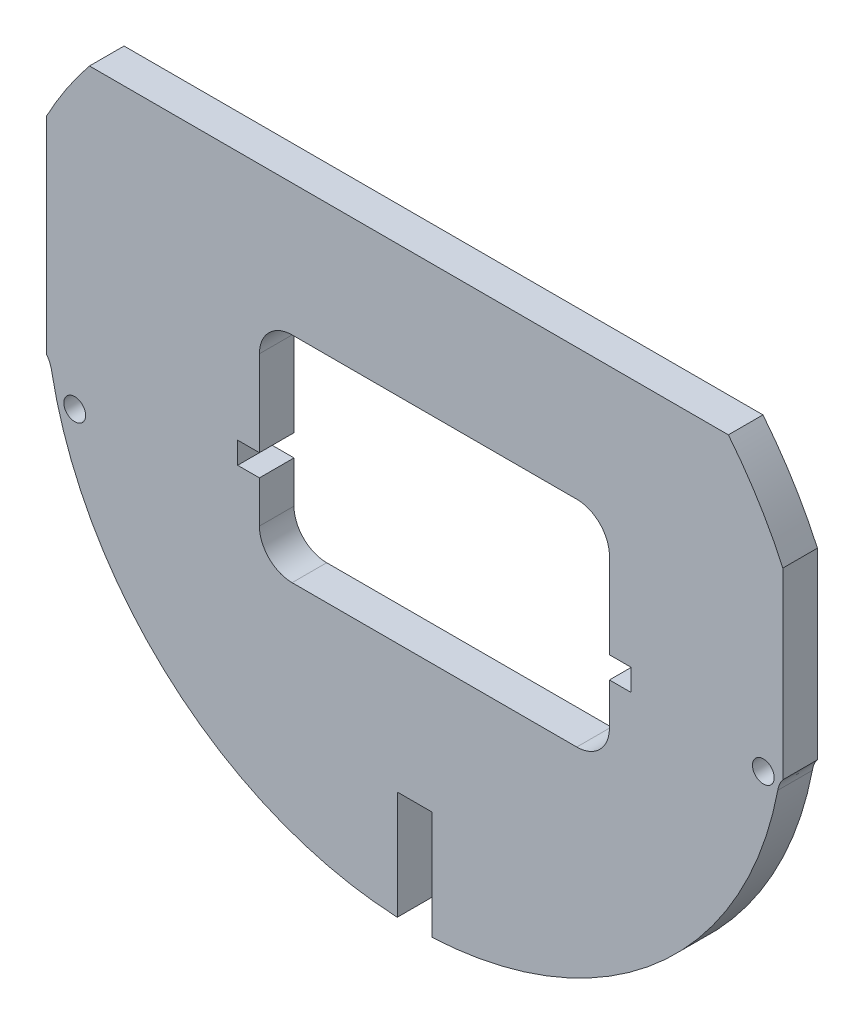
ISO-10303-21;
HEADER;
FILE_DESCRIPTION(('STEP AP214'),'2;1');
FILE_NAME('part.step','',(''),(''),'','','');
FILE_SCHEMA(('AUTOMOTIVE_DESIGN { 1 0 10303 214 1 1 1 1 }'));
ENDSEC;
DATA;
#1=APPLICATION_CONTEXT('core data for automotive mechanical design processes');
#2=APPLICATION_PROTOCOL_DEFINITION('international standard','automotive_design',2000,#1);
#3=PRODUCT_CONTEXT('',#1,'mechanical');
#4=PRODUCT('Part','Part','',(#3));
#5=PRODUCT_RELATED_PRODUCT_CATEGORY('part','',(#4));
#6=PRODUCT_DEFINITION_FORMATION('','',#4);
#7=PRODUCT_DEFINITION_CONTEXT('part definition',#1,'design');
#8=PRODUCT_DEFINITION('design','',#6,#7);
#9=PRODUCT_DEFINITION_SHAPE('','',#8);
#10=(LENGTH_UNIT() NAMED_UNIT(*) SI_UNIT(.MILLI.,.METRE.));
#11=(NAMED_UNIT(*) PLANE_ANGLE_UNIT() SI_UNIT($,.RADIAN.));
#12=(NAMED_UNIT(*) SI_UNIT($,.STERADIAN.) SOLID_ANGLE_UNIT());
#13=UNCERTAINTY_MEASURE_WITH_UNIT(LENGTH_MEASURE(1.E-05),#10,'distance_accuracy_value','');
#14=(GEOMETRIC_REPRESENTATION_CONTEXT(3) GLOBAL_UNCERTAINTY_ASSIGNED_CONTEXT((#13)) GLOBAL_UNIT_ASSIGNED_CONTEXT((#10,
#11,#12)) REPRESENTATION_CONTEXT('',''));
#15=CARTESIAN_POINT('',(0.,0.,0.));
#16=DIRECTION('',(0.,0.,1.));
#17=DIRECTION('',(1.,0.,0.));
#18=AXIS2_PLACEMENT_3D('',#15,#16,#17);
#19=CARTESIAN_POINT('',(-2.77978334795037E-09,0.129577602026689,1.5875));
#20=DIRECTION('',(0.,0.,-1.));
#21=DIRECTION('',(-1.,0.,0.));
#22=AXIS2_PLACEMENT_3D('',#19,#20,#21);
#23=CYLINDRICAL_SURFACE('',#22,33.9291564788546);
#24=CARTESIAN_POINT('',(-2.77978334795037E-09,0.129577602026689,1.5875));
#25=DIRECTION('',(0.,0.,1.));
#26=DIRECTION('',(1.,0.,0.));
#27=AXIS2_PLACEMENT_3D('',#24,#25,#26);
#28=CIRCLE('',#27,33.9291564788546);
#29=CARTESIAN_POINT('',(1.57437295803338,-33.7630323468525,1.5875));
#30=VERTEX_POINT('',#29);
#31=CARTESIAN_POINT('',(33.3337355807531,-6.19890811050484,1.5875));
#32=VERTEX_POINT('',#31);
#33=EDGE_CURVE('E442',#30,#32,#28,.T.);
#34=ORIENTED_EDGE('',*,*,#33,.F.);
#35=DIRECTION('',(0.,0.,-1.));
#36=VECTOR('',#35,1.);
#37=CARTESIAN_POINT('',(1.57437295803338,-33.7630323468525,1.5875));
#38=LINE('',#37,#36);
#39=CARTESIAN_POINT('',(1.57437295803338,-33.7630323468525,-1.5875));
#40=VERTEX_POINT('',#39);
#41=EDGE_CURVE('E332',#30,#40,#38,.T.);
#42=ORIENTED_EDGE('',*,*,#41,.T.);
#43=CARTESIAN_POINT('',(-2.77978334795037E-09,0.129577602026689,-1.5875));
#44=DIRECTION('',(0.,0.,1.));
#45=DIRECTION('',(1.,0.,0.));
#46=AXIS2_PLACEMENT_3D('',#43,#44,#45);
#47=CIRCLE('',#46,33.9291564788546);
#48=CARTESIAN_POINT('',(33.3337355807531,-6.19890811050484,-1.5875));
#49=VERTEX_POINT('',#48);
#50=EDGE_CURVE('E415',#40,#49,#47,.T.);
#51=ORIENTED_EDGE('',*,*,#50,.T.);
#52=DIRECTION('',(0.,0.,-1.));
#53=VECTOR('',#52,1.);
#54=CARTESIAN_POINT('',(33.3337355807531,-6.19890811050484,1.5875));
#55=LINE('',#54,#53);
#56=EDGE_CURVE('E451',#32,#49,#55,.T.);
#57=ORIENTED_EDGE('',*,*,#56,.F.);
#58=EDGE_LOOP('',(#34,#42,#51,#57));
#59=FACE_BOUND('',#58,.T.);
#60=ADVANCED_FACE('F41',(#59),#23,.T.);
#61=CARTESIAN_POINT('',(0.,19.7995977133014,1.5875));
#62=DIRECTION('',(0.,1.,0.));
#63=DIRECTION('',(0.,0.,1.));
#64=AXIS2_PLACEMENT_3D('',#61,#62,#63);
#65=PLANE('',#64);
#66=DIRECTION('',(1.,0.,0.));
#67=VECTOR('',#66,1.);
#68=CARTESIAN_POINT('',(0.,19.7995977133014,-1.5875));
#69=LINE('',#68,#67);
#70=CARTESIAN_POINT('',(-29.8610470161256,19.7995977133014,-1.5875));
#71=VERTEX_POINT('',#70);
#72=CARTESIAN_POINT('',(28.7983235841199,19.7995977133014,-1.5875));
#73=VERTEX_POINT('',#72);
#74=EDGE_CURVE('E339',#71,#73,#69,.T.);
#75=ORIENTED_EDGE('',*,*,#74,.F.);
#76=DIRECTION('',(0.,0.,-1.));
#77=VECTOR('',#76,1.);
#78=CARTESIAN_POINT('',(-29.8610470161256,19.7995977133014,1.5875));
#79=LINE('',#78,#77);
#80=CARTESIAN_POINT('',(-29.8610470161256,19.7995977133014,1.5875));
#81=VERTEX_POINT('',#80);
#82=EDGE_CURVE('E435',#81,#71,#79,.T.);
#83=ORIENTED_EDGE('',*,*,#82,.F.);
#84=DIRECTION('',(1.,0.,0.));
#85=VECTOR('',#84,1.);
#86=CARTESIAN_POINT('',(0.,19.7995977133014,1.5875));
#87=LINE('',#86,#85);
#88=CARTESIAN_POINT('',(28.7983235841199,19.7995977133014,1.5875));
#89=VERTEX_POINT('',#88);
#90=EDGE_CURVE('E348',#81,#89,#87,.T.);
#91=ORIENTED_EDGE('',*,*,#90,.T.);
#92=DIRECTION('',(0.,0.,-1.));
#93=VECTOR('',#92,1.);
#94=CARTESIAN_POINT('',(28.7983235841199,19.7995977133014,1.5875));
#95=LINE('',#94,#93);
#96=EDGE_CURVE('E491',#89,#73,#95,.T.);
#97=ORIENTED_EDGE('',*,*,#96,.T.);
#98=EDGE_LOOP('',(#75,#83,#91,#97));
#99=FACE_BOUND('',#98,.T.);
#100=ADVANCED_FACE('F43',(#99),#65,.T.);
#101=CARTESIAN_POINT('',(-0.531361716002824,-3.91306400992144,1.5875));
#102=DIRECTION('',(0.,0.,-1.));
#103=DIRECTION('',(-1.,0.,0.));
#104=AXIS2_PLACEMENT_3D('',#101,#102,#103);
#105=CYLINDRICAL_SURFACE('',#104,37.7163196216735);
#106=CARTESIAN_POINT('',(-0.531361716002824,-3.91306400992144,-1.5875));
#107=DIRECTION('',(0.,0.,1.));
#108=DIRECTION('',(1.,0.,0.));
#109=AXIS2_PLACEMENT_3D('',#106,#107,#108);
#110=CIRCLE('',#109,37.7163196216735);
#111=CARTESIAN_POINT('',(-33.8000174034665,13.8553718962924,-1.5875));
#112=VERTEX_POINT('',#111);
#113=EDGE_CURVE('E494',#71,#112,#110,.T.);
#114=ORIENTED_EDGE('',*,*,#113,.T.);
#115=DIRECTION('',(0.,0.,-1.));
#116=VECTOR('',#115,1.);
#117=CARTESIAN_POINT('',(-33.8000174034665,13.8553718962924,1.5875));
#118=LINE('',#117,#116);
#119=CARTESIAN_POINT('',(-33.8000174034665,13.8553718962924,1.5875));
#120=VERTEX_POINT('',#119);
#121=EDGE_CURVE('E518',#120,#112,#118,.T.);
#122=ORIENTED_EDGE('',*,*,#121,.F.);
#123=CARTESIAN_POINT('',(-0.531361716002824,-3.91306400992144,1.5875));
#124=DIRECTION('',(0.,0.,1.));
#125=DIRECTION('',(1.,0.,0.));
#126=AXIS2_PLACEMENT_3D('',#123,#124,#125);
#127=CIRCLE('',#126,37.7163196216735);
#128=EDGE_CURVE('E351',#81,#120,#127,.T.);
#129=ORIENTED_EDGE('',*,*,#128,.F.);
#130=ORIENTED_EDGE('',*,*,#82,.T.);
#131=EDGE_LOOP('',(#114,#122,#129,#130));
#132=FACE_BOUND('',#131,.T.);
#133=ADVANCED_FACE('F376',(#132),#105,.T.);
#134=CARTESIAN_POINT('',(-33.8000174034665,0.,1.5875));
#135=DIRECTION('',(1.,0.,0.));
#136=DIRECTION('',(0.,1.,0.));
#137=AXIS2_PLACEMENT_3D('',#134,#135,#136);
#138=PLANE('',#137);
#139=DIRECTION('',(0.,-1.,0.));
#140=VECTOR('',#139,1.);
#141=CARTESIAN_POINT('',(-33.8000174034665,0.,-1.5875));
#142=LINE('',#141,#140);
#143=CARTESIAN_POINT('',(-33.8000174034665,-5.12928189645589,-1.5875));
#144=VERTEX_POINT('',#143);
#145=EDGE_CURVE('E496',#112,#144,#142,.T.);
#146=ORIENTED_EDGE('',*,*,#145,.T.);
#147=DIRECTION('',(0.,0.,-1.));
#148=VECTOR('',#147,1.);
#149=CARTESIAN_POINT('',(-33.8000174034665,-5.12928189645589,1.5875));
#150=LINE('',#149,#148);
#151=CARTESIAN_POINT('',(-33.8000174034665,-5.12928189645589,1.5875));
#152=VERTEX_POINT('',#151);
#153=EDGE_CURVE('E515',#152,#144,#150,.T.);
#154=ORIENTED_EDGE('',*,*,#153,.F.);
#155=DIRECTION('',(0.,-1.,0.));
#156=VECTOR('',#155,1.);
#157=CARTESIAN_POINT('',(-33.8000174034665,0.,1.5875));
#158=LINE('',#157,#156);
#159=EDGE_CURVE('E354',#120,#152,#158,.T.);
#160=ORIENTED_EDGE('',*,*,#159,.F.);
#161=ORIENTED_EDGE('',*,*,#121,.T.);
#162=EDGE_LOOP('',(#146,#154,#160,#161));
#163=FACE_BOUND('',#162,.T.);
#164=ADVANCED_FACE('F372',(#163),#138,.F.);
#165=CARTESIAN_POINT('',(-33.8000174034665,-5.12928189645588,1.5875));
#166=CARTESIAN_POINT('',(-33.5420465161311,-5.43101031850378,1.5875));
#167=CARTESIAN_POINT('',(-33.4072615265148,-5.80935987271673,1.5875));
#168=CARTESIAN_POINT('',(-33.3339917518121,-6.19755224412202,1.5875));
#169=B_SPLINE_CURVE_WITH_KNOTS('',3,(#165,#166,#167,#168),.UNSPECIFIED.,.F.,.F.,(4,4),(0.,1.),.UNSPECIFIED.);
#170=DIRECTION('',(0.,0.,-1.));
#171=VECTOR('',#170,1.);
#172=SURFACE_OF_LINEAR_EXTRUSION('',#169,#171);
#173=CARTESIAN_POINT('',(-33.8000174034665,-5.12928189645588,-1.5875));
#174=CARTESIAN_POINT('',(-33.5420465161311,-5.43101031850378,-1.5875));
#175=CARTESIAN_POINT('',(-33.4072615265148,-5.80935987271673,-1.5875));
#176=CARTESIAN_POINT('',(-33.3339917518121,-6.19755224412202,-1.5875));
#177=B_SPLINE_CURVE_WITH_KNOTS('',3,(#173,#174,#175,#176),.UNSPECIFIED.,.F.,.F.,(4,4),(0.,1.),.UNSPECIFIED.);
#178=CARTESIAN_POINT('',(-33.3339924261858,-6.19755249274547,-1.5875));
#179=VERTEX_POINT('',#178);
#180=EDGE_CURVE('E498',#144,#179,#177,.T.);
#181=ORIENTED_EDGE('',*,*,#180,.T.);
#182=DIRECTION('',(0.,0.,-1.));
#183=VECTOR('',#182,1.);
#184=CARTESIAN_POINT('',(-33.3339924261858,-6.19755249274547,1.5875));
#185=LINE('',#184,#183);
#186=CARTESIAN_POINT('',(-33.3339924261858,-6.19755249274547,1.5875));
#187=VERTEX_POINT('',#186);
#188=EDGE_CURVE('E512',#187,#179,#185,.T.);
#189=ORIENTED_EDGE('',*,*,#188,.F.);
#190=EDGE_CURVE('E356',#152,#187,#169,.T.);
#191=ORIENTED_EDGE('',*,*,#190,.F.);
#192=ORIENTED_EDGE('',*,*,#153,.T.);
#193=EDGE_LOOP('',(#181,#189,#191,#192));
#194=FACE_BOUND('',#193,.T.);
#195=ADVANCED_FACE('F367',(#194),#172,.F.);
#196=CARTESIAN_POINT('',(0.,0.105054097099121,1.5875));
#197=DIRECTION('',(0.,0.,-1.));
#198=DIRECTION('',(-1.,0.,0.));
#199=AXIS2_PLACEMENT_3D('',#196,#197,#198);
#200=CYLINDRICAL_SURFACE('',#199,33.9245913887753);
#201=CARTESIAN_POINT('',(0.,0.105054097099121,-1.5875));
#202=DIRECTION('',(0.,0.,1.));
#203=DIRECTION('',(1.,0.,0.));
#204=AXIS2_PLACEMENT_3D('',#201,#202,#203);
#205=CIRCLE('',#204,33.9245913887753);
#206=CARTESIAN_POINT('',(-33.3337360676582,-6.19890820188936,-1.5875));
#207=VERTEX_POINT('',#206);
#208=EDGE_CURVE('E418',#179,#207,#205,.T.);
#209=ORIENTED_EDGE('',*,*,#208,.T.);
#210=DIRECTION('',(0.,0.,-1.));
#211=VECTOR('',#210,1.);
#212=CARTESIAN_POINT('',(-33.3337360676582,-6.19890820188936,1.5875));
#213=LINE('',#212,#211);
#214=CARTESIAN_POINT('',(-33.3337360676582,-6.19890820188936,1.5875));
#215=VERTEX_POINT('',#214);
#216=EDGE_CURVE('E410',#215,#207,#213,.T.);
#217=ORIENTED_EDGE('',*,*,#216,.F.);
#218=CARTESIAN_POINT('',(0.,0.105054097099121,1.5875));
#219=DIRECTION('',(0.,0.,1.));
#220=DIRECTION('',(1.,0.,0.));
#221=AXIS2_PLACEMENT_3D('',#218,#219,#220);
#222=CIRCLE('',#221,33.9245913887753);
#223=EDGE_CURVE('E361',#187,#215,#222,.T.);
#224=ORIENTED_EDGE('',*,*,#223,.F.);
#225=ORIENTED_EDGE('',*,*,#188,.T.);
#226=EDGE_LOOP('',(#209,#217,#224,#225));
#227=FACE_BOUND('',#226,.T.);
#228=ADVANCED_FACE('F371',(#227),#200,.T.);
#229=CARTESIAN_POINT('',(-1.60062704196662,-33.7618026066345,-1.5875));
#230=VERTEX_POINT('',#229);
#231=EDGE_CURVE('E406',#207,#230,#47,.T.);
#232=ORIENTED_EDGE('',*,*,#231,.T.);
#233=DIRECTION('',(0.,0.,-1.));
#234=VECTOR('',#233,1.);
#235=CARTESIAN_POINT('',(-1.60062704196662,-33.7618026066344,1.5875));
#236=LINE('',#235,#234);
#237=CARTESIAN_POINT('',(-1.60062704196662,-33.7618026066345,1.5875));
#238=VERTEX_POINT('',#237);
#239=EDGE_CURVE('E328',#230,#238,#236,.F.);
#240=ORIENTED_EDGE('',*,*,#239,.T.);
#241=EDGE_CURVE('E445',#215,#238,#28,.T.);
#242=ORIENTED_EDGE('',*,*,#241,.F.);
#243=ORIENTED_EDGE('',*,*,#216,.T.);
#244=EDGE_LOOP('',(#232,#240,#242,#243));
#245=FACE_BOUND('',#244,.T.);
#246=ADVANCED_FACE('F386',(#245),#23,.T.);
#247=CARTESIAN_POINT('',(33.3337360620987,-6.19890820188937,1.5875));
#248=CARTESIAN_POINT('',(33.3702736485357,-6.0049524899182,1.5875));
#249=CARTESIAN_POINT('',(33.4208271632723,-5.81577116696376,1.5875));
#250=CARTESIAN_POINT('',(33.5703270651029,-5.45389308014613,1.5875));
#251=CARTESIAN_POINT('',(33.6709126996301,-5.28028559029285,1.5875));
#252=CARTESIAN_POINT('',(33.8000173979069,-5.12928189645592,1.5875));
#253=B_SPLINE_CURVE_WITH_KNOTS('',3,(#247,#248,#249,#250,#251,#252),.UNSPECIFIED.,.F.,.F.,(4,2,
4),(0.,0.5,1.),.UNSPECIFIED.);
#254=DIRECTION('',(0.,0.,-1.));
#255=VECTOR('',#254,1.);
#256=SURFACE_OF_LINEAR_EXTRUSION('',#253,#255);
#257=CARTESIAN_POINT('',(33.3337360620987,-6.19890820188937,-1.5875));
#258=CARTESIAN_POINT('',(33.3702736485357,-6.0049524899182,-1.5875));
#259=CARTESIAN_POINT('',(33.4208271632723,-5.81577116696376,-1.5875));
#260=CARTESIAN_POINT('',(33.5703270651029,-5.45389308014613,-1.5875));
#261=CARTESIAN_POINT('',(33.6709126996301,-5.28028559029285,-1.5875));
#262=CARTESIAN_POINT('',(33.8000173979069,-5.12928189645592,-1.5875));
#263=B_SPLINE_CURVE_WITH_KNOTS('',3,(#257,#258,#259,#260,#261,#262),.UNSPECIFIED.,.F.,.F.,(4,2,
4),(0.,0.5,1.),.UNSPECIFIED.);
#264=CARTESIAN_POINT('',(33.8000173979069,-5.1292818964559,-1.5875));
#265=VERTEX_POINT('',#264);
#266=EDGE_CURVE('E414',#49,#265,#263,.T.);
#267=ORIENTED_EDGE('',*,*,#266,.T.);
#268=DIRECTION('',(0.,0.,-1.));
#269=VECTOR('',#268,1.);
#270=CARTESIAN_POINT('',(33.8000173979069,-5.1292818964559,1.5875));
#271=LINE('',#270,#269);
#272=CARTESIAN_POINT('',(33.8000173979069,-5.1292818964559,1.5875));
#273=VERTEX_POINT('',#272);
#274=EDGE_CURVE('E455',#273,#265,#271,.T.);
#275=ORIENTED_EDGE('',*,*,#274,.F.);
#276=CARTESIAN_POINT('',(33.8000173979069,-5.12928189645592,1.5875));
#277=CARTESIAN_POINT('',(33.6709126996301,-5.28028559029285,1.5875));
#278=CARTESIAN_POINT('',(33.5703270651029,-5.45389308014613,1.5875));
#279=CARTESIAN_POINT('',(33.4208271632723,-5.81577116696376,1.5875));
#280=CARTESIAN_POINT('',(33.3702736485357,-6.0049524899182,1.5875));
#281=CARTESIAN_POINT('',(33.3337360620987,-6.19890820188937,1.5875));
#282=B_SPLINE_CURVE_WITH_KNOTS('',3,(#276,#277,#278,#279,#280,#281),.UNSPECIFIED.,.F.,.F.,(4,2,
4),(0.,0.5,1.),.UNSPECIFIED.);
#283=EDGE_CURVE('E466',#32,#273,#282,.F.);
#284=ORIENTED_EDGE('',*,*,#283,.F.);
#285=ORIENTED_EDGE('',*,*,#56,.T.);
#286=EDGE_LOOP('',(#267,#275,#284,#285));
#287=FACE_BOUND('',#286,.T.);
#288=ADVANCED_FACE('F393',(#287),#256,.F.);
#289=CARTESIAN_POINT('',(33.8000173979069,0.,1.5875));
#290=DIRECTION('',(-1.,0.,0.));
#291=DIRECTION('',(0.,0.,1.));
#292=AXIS2_PLACEMENT_3D('',#289,#290,#291);
#293=PLANE('',#292);
#294=DIRECTION('',(0.,1.,0.));
#295=VECTOR('',#294,1.);
#296=CARTESIAN_POINT('',(33.8000173979069,0.,-1.5875));
#297=LINE('',#296,#295);
#298=CARTESIAN_POINT('',(33.8000173979069,11.7035032806593,-1.5875));
#299=VERTEX_POINT('',#298);
#300=EDGE_CURVE('E417',#265,#299,#297,.T.);
#301=ORIENTED_EDGE('',*,*,#300,.T.);
#302=DIRECTION('',(0.,0.,-1.));
#303=VECTOR('',#302,1.);
#304=CARTESIAN_POINT('',(33.8000173979069,11.7035032806593,1.5875));
#305=LINE('',#304,#303);
#306=CARTESIAN_POINT('',(33.8000173979069,11.7035032806593,1.5875));
#307=VERTEX_POINT('',#306);
#308=EDGE_CURVE('E460',#307,#299,#305,.T.);
#309=ORIENTED_EDGE('',*,*,#308,.F.);
#310=DIRECTION('',(0.,1.,0.));
#311=VECTOR('',#310,1.);
#312=CARTESIAN_POINT('',(33.8000173979069,0.,1.5875));
#313=LINE('',#312,#311);
#314=EDGE_CURVE('E463',#273,#307,#313,.T.);
#315=ORIENTED_EDGE('',*,*,#314,.F.);
#316=ORIENTED_EDGE('',*,*,#274,.T.);
#317=EDGE_LOOP('',(#301,#309,#315,#316));
#318=FACE_BOUND('',#317,.T.);
#319=ADVANCED_FACE('F399',(#318),#293,.F.);
#320=CARTESIAN_POINT('',(-0.531361716002824,-3.91306400992144,1.5875));
#321=DIRECTION('',(0.,0.,-1.));
#322=DIRECTION('',(-1.,0.,0.));
#323=AXIS2_PLACEMENT_3D('',#320,#321,#322);
#324=CYLINDRICAL_SURFACE('',#323,37.7163196216735);
#325=CARTESIAN_POINT('',(-0.531361716002824,-3.91306400992144,-1.5875));
#326=DIRECTION('',(0.,0.,1.));
#327=DIRECTION('',(1.,0.,0.));
#328=AXIS2_PLACEMENT_3D('',#325,#326,#327);
#329=CIRCLE('',#328,37.7163196216735);
#330=EDGE_CURVE('E352',#299,#73,#329,.T.);
#331=ORIENTED_EDGE('',*,*,#330,.T.);
#332=ORIENTED_EDGE('',*,*,#96,.F.);
#333=CARTESIAN_POINT('',(-0.531361716002824,-3.91306400992144,1.5875));
#334=DIRECTION('',(0.,0.,1.));
#335=DIRECTION('',(1.,0.,0.));
#336=AXIS2_PLACEMENT_3D('',#333,#334,#335);
#337=CIRCLE('',#336,37.7163196216735);
#338=EDGE_CURVE('E465',#307,#89,#337,.T.);
#339=ORIENTED_EDGE('',*,*,#338,.F.);
#340=ORIENTED_EDGE('',*,*,#308,.T.);
#341=EDGE_LOOP('',(#331,#332,#339,#340));
#342=FACE_BOUND('',#341,.T.);
#343=ADVANCED_FACE('F537',(#342),#324,.T.);
#344=CARTESIAN_POINT('',(0.,0.,1.5875));
#345=DIRECTION('',(0.,0.,1.));
#346=DIRECTION('',(1.,0.,0.));
#347=AXIS2_PLACEMENT_3D('',#344,#345,#346);
#348=PLANE('',#347);
#349=DIRECTION('',(0.,-1.,0.));
#350=VECTOR('',#349,1.);
#351=CARTESIAN_POINT('',(-14.2577246988936,0.,1.5875));
#352=LINE('',#351,#350);
#353=CARTESIAN_POINT('',(-14.2577246988936,4.7171836988647,1.5875));
#354=VERTEX_POINT('',#353);
#355=CARTESIAN_POINT('',(-14.2577246988936,-3.1501579017386,1.5875));
#356=VERTEX_POINT('',#355);
#357=EDGE_CURVE('E56',#354,#356,#352,.T.);
#358=ORIENTED_EDGE('',*,*,#357,.F.);
#359=CARTESIAN_POINT('',(-11.2577246988936,4.7171836988647,1.5875));
#360=DIRECTION('',(0.,0.,1.));
#361=DIRECTION('',(1.,0.,0.));
#362=AXIS2_PLACEMENT_3D('',#359,#360,#361);
#363=CIRCLE('',#362,3.);
#364=CARTESIAN_POINT('',(-11.2577246988936,7.71718369886469,1.5875));
#365=VERTEX_POINT('',#364);
#366=EDGE_CURVE('E286',#365,#354,#363,.T.);
#367=ORIENTED_EDGE('',*,*,#366,.F.);
#368=DIRECTION('',(-1.,0.,0.));
#369=VECTOR('',#368,1.);
#370=CARTESIAN_POINT('',(0.,7.71718369886469,1.5875));
#371=LINE('',#370,#369);
#372=CARTESIAN_POINT('',(14.8786006125927,7.71718369886469,1.5875));
#373=VERTEX_POINT('',#372);
#374=EDGE_CURVE('E283',#373,#365,#371,.T.);
#375=ORIENTED_EDGE('',*,*,#374,.F.);
#376=CARTESIAN_POINT('',(14.8786006125927,4.7171836988647,1.5875));
#377=DIRECTION('',(0.,0.,1.));
#378=DIRECTION('',(1.,0.,0.));
#379=AXIS2_PLACEMENT_3D('',#376,#377,#378);
#380=CIRCLE('',#379,3.);
#381=CARTESIAN_POINT('',(17.8786006125927,4.7171836988647,1.5875));
#382=VERTEX_POINT('',#381);
#383=EDGE_CURVE('E280',#382,#373,#380,.T.);
#384=ORIENTED_EDGE('',*,*,#383,.F.);
#385=DIRECTION('',(0.,1.,0.));
#386=VECTOR('',#385,1.);
#387=CARTESIAN_POINT('',(17.8786006125927,0.,1.5875));
#388=LINE('',#387,#386);
#389=CARTESIAN_POINT('',(17.8786006125927,-3.1501579017386,1.5875));
#390=VERTEX_POINT('',#389);
#391=EDGE_CURVE('E271',#390,#382,#388,.T.);
#392=ORIENTED_EDGE('',*,*,#391,.F.);
#393=DIRECTION('',(1.,0.,0.));
#394=VECTOR('',#393,1.);
#395=CARTESIAN_POINT('',(0.,-3.15015790173858,1.5875));
#396=LINE('',#395,#394);
#397=CARTESIAN_POINT('',(19.8786006125927,-3.1501579017386,1.5875));
#398=VERTEX_POINT('',#397);
#399=EDGE_CURVE('E277',#390,#398,#396,.T.);
#400=ORIENTED_EDGE('',*,*,#399,.T.);
#401=DIRECTION('',(0.,-1.,0.));
#402=VECTOR('',#401,1.);
#403=CARTESIAN_POINT('',(19.8786006125928,-1.37935500608926E-13,1.5875));
#404=LINE('',#403,#402);
#405=CARTESIAN_POINT('',(19.8786006125927,-5.1501579017386,1.5875));
#406=VERTEX_POINT('',#405);
#407=EDGE_CURVE('E274',#398,#406,#404,.T.);
#408=ORIENTED_EDGE('',*,*,#407,.T.);
#409=DIRECTION('',(-1.,0.,0.));
#410=VECTOR('',#409,1.);
#411=CARTESIAN_POINT('',(0.,-5.1501579017386,1.5875));
#412=LINE('',#411,#410);
#413=CARTESIAN_POINT('',(17.8786006125927,-5.1501579017386,1.5875));
#414=VERTEX_POINT('',#413);
#415=EDGE_CURVE('E270',#406,#414,#412,.T.);
#416=ORIENTED_EDGE('',*,*,#415,.T.);
#417=CARTESIAN_POINT('',(17.8786006125927,-8.98425628314143,1.5875));
#418=VERTEX_POINT('',#417);
#419=EDGE_CURVE('E267',#418,#414,#388,.T.);
#420=ORIENTED_EDGE('',*,*,#419,.F.);
#421=CARTESIAN_POINT('',(14.8786006125927,-8.98425628314143,1.5875));
#422=DIRECTION('',(0.,0.,1.));
#423=DIRECTION('',(1.,0.,0.));
#424=AXIS2_PLACEMENT_3D('',#421,#422,#423);
#425=CIRCLE('',#424,3.);
#426=CARTESIAN_POINT('',(14.8786006125927,-11.9842562831414,1.5875));
#427=VERTEX_POINT('',#426);
#428=EDGE_CURVE('E264',#427,#418,#425,.T.);
#429=ORIENTED_EDGE('',*,*,#428,.F.);
#430=DIRECTION('',(1.,0.,0.));
#431=VECTOR('',#430,1.);
#432=CARTESIAN_POINT('',(0.,-11.9842562831414,1.5875));
#433=LINE('',#432,#431);
#434=CARTESIAN_POINT('',(-11.2577246988936,-11.9842562831414,1.5875));
#435=VERTEX_POINT('',#434);
#436=EDGE_CURVE('E261',#435,#427,#433,.T.);
#437=ORIENTED_EDGE('',*,*,#436,.F.);
#438=CARTESIAN_POINT('',(-11.2577246988936,-8.98425628314143,1.5875));
#439=DIRECTION('',(0.,0.,1.));
#440=DIRECTION('',(1.,0.,0.));
#441=AXIS2_PLACEMENT_3D('',#438,#439,#440);
#442=CIRCLE('',#441,3.);
#443=CARTESIAN_POINT('',(-14.2577246988936,-8.98425628314143,1.5875));
#444=VERTEX_POINT('',#443);
#445=EDGE_CURVE('E258',#444,#435,#442,.T.);
#446=ORIENTED_EDGE('',*,*,#445,.F.);
#447=CARTESIAN_POINT('',(-14.2577246988936,-5.1501579017386,1.5875));
#448=VERTEX_POINT('',#447);
#449=EDGE_CURVE('E254',#448,#444,#352,.T.);
#450=ORIENTED_EDGE('',*,*,#449,.F.);
#451=DIRECTION('',(1.,0.,0.));
#452=VECTOR('',#451,1.);
#453=CARTESIAN_POINT('',(0.,-5.1501579017386,1.5875));
#454=LINE('',#453,#452);
#455=CARTESIAN_POINT('',(-16.2577246988936,-5.1501579017386,1.5875));
#456=VERTEX_POINT('',#455);
#457=EDGE_CURVE('E252',#456,#448,#454,.T.);
#458=ORIENTED_EDGE('',*,*,#457,.F.);
#459=DIRECTION('',(0.,-1.,0.));
#460=VECTOR('',#459,1.);
#461=CARTESIAN_POINT('',(-16.2577246988936,-1.12810626804555E-13,1.5875));
#462=LINE('',#461,#460);
#463=CARTESIAN_POINT('',(-16.2577246988936,-3.1501579017386,1.5875));
#464=VERTEX_POINT('',#463);
#465=EDGE_CURVE('E235',#464,#456,#462,.T.);
#466=ORIENTED_EDGE('',*,*,#465,.F.);
#467=DIRECTION('',(-1.,0.,0.));
#468=VECTOR('',#467,1.);
#469=CARTESIAN_POINT('',(0.,-3.15015790173859,1.5875));
#470=LINE('',#469,#468);
#471=EDGE_CURVE('E244',#356,#464,#470,.T.);
#472=ORIENTED_EDGE('',*,*,#471,.F.);
#473=EDGE_LOOP('',(#358,#367,#375,#384,#392,#400,#408,#416,#420,#429,#437,#446,#450,#458,#466,#472));
#474=FACE_BOUND('',#473,.T.);
#475=DIRECTION('',(0.,1.,0.));
#476=VECTOR('',#475,1.);
#477=CARTESIAN_POINT('',(1.57437295803338,-34.7701759650406,1.5875));
#478=LINE('',#477,#476);
#479=CARTESIAN_POINT('',(1.57437295803338,-23.7996045123723,1.5875));
#480=VERTEX_POINT('',#479);
#481=EDGE_CURVE('E322',#30,#480,#478,.T.);
#482=ORIENTED_EDGE('',*,*,#481,.F.);
#483=ORIENTED_EDGE('',*,*,#33,.T.);
#484=ORIENTED_EDGE('',*,*,#283,.T.);
#485=ORIENTED_EDGE('',*,*,#314,.T.);
#486=ORIENTED_EDGE('',*,*,#338,.T.);
#487=ORIENTED_EDGE('',*,*,#90,.F.);
#488=ORIENTED_EDGE('',*,*,#128,.T.);
#489=ORIENTED_EDGE('',*,*,#159,.T.);
#490=ORIENTED_EDGE('',*,*,#190,.T.);
#491=ORIENTED_EDGE('',*,*,#223,.T.);
#492=ORIENTED_EDGE('',*,*,#241,.T.);
#493=DIRECTION('',(0.,-1.,0.));
#494=VECTOR('',#493,1.);
#495=CARTESIAN_POINT('',(-1.60062704196662,-23.7996045123723,1.5875));
#496=LINE('',#495,#494);
#497=CARTESIAN_POINT('',(-1.60062704196662,-23.7996045123723,1.5875));
#498=VERTEX_POINT('',#497);
#499=EDGE_CURVE('E320',#498,#238,#496,.T.);
#500=ORIENTED_EDGE('',*,*,#499,.F.);
#501=DIRECTION('',(-1.,0.,0.));
#502=VECTOR('',#501,1.);
#503=CARTESIAN_POINT('',(-1.60062704196662,-23.7996045123723,1.5875));
#504=LINE('',#503,#502);
#505=EDGE_CURVE('E291',#480,#498,#504,.T.);
#506=ORIENTED_EDGE('',*,*,#505,.F.);
#507=EDGE_LOOP('',(#482,#483,#484,#485,#486,#487,#488,#489,#490,#491,#492,#500,#506));
#508=FACE_BOUND('',#507,.T.);
#509=CARTESIAN_POINT('',(-31.2160643993176,-8.16443665346959,1.5875));
#510=DIRECTION('',(0.,0.,1.));
#511=DIRECTION('',(1.,0.,0.));
#512=AXIS2_PLACEMENT_3D('',#509,#510,#511);
#513=CIRCLE('',#512,1.);
#514=CARTESIAN_POINT('',(-30.2160643993176,-8.16443665346959,1.5875));
#515=VERTEX_POINT('',#514);
#516=EDGE_CURVE('E340',#515,#515,#513,.T.);
#517=ORIENTED_EDGE('',*,*,#516,.F.);
#518=EDGE_LOOP('',(#517));
#519=FACE_BOUND('',#518,.T.);
#520=CARTESIAN_POINT('',(32.0093023749139,-5.35898951564747,1.5875));
#521=DIRECTION('',(0.,0.,1.));
#522=DIRECTION('',(1.,0.,0.));
#523=AXIS2_PLACEMENT_3D('',#520,#521,#522);
#524=CIRCLE('',#523,0.999999999998764);
#525=CARTESIAN_POINT('',(33.0093023749126,-5.35898951564747,1.5875));
#526=VERTEX_POINT('',#525);
#527=EDGE_CURVE('E343',#526,#526,#524,.T.);
#528=ORIENTED_EDGE('',*,*,#527,.F.);
#529=EDGE_LOOP('',(#528));
#530=FACE_BOUND('',#529,.T.);
#531=ADVANCED_FACE('F248',(#474,#508,#519,#530),#348,.T.);
#532=CARTESIAN_POINT('',(0.,0.,-1.5875));
#533=DIRECTION('',(0.,0.,1.));
#534=DIRECTION('',(1.,0.,0.));
#535=AXIS2_PLACEMENT_3D('',#532,#533,#534);
#536=PLANE('',#535);
#537=CARTESIAN_POINT('',(-11.2577246988936,4.7171836988647,-1.5875));
#538=DIRECTION('',(0.,0.,1.));
#539=DIRECTION('',(1.,0.,0.));
#540=AXIS2_PLACEMENT_3D('',#537,#538,#539);
#541=CIRCLE('',#540,3.);
#542=CARTESIAN_POINT('',(-11.2577246988936,7.71718369886469,-1.5875));
#543=VERTEX_POINT('',#542);
#544=CARTESIAN_POINT('',(-14.2577246988936,4.7171836988647,-1.5875));
#545=VERTEX_POINT('',#544);
#546=EDGE_CURVE('E49',#543,#545,#541,.T.);
#547=ORIENTED_EDGE('',*,*,#546,.T.);
#548=DIRECTION('',(0.,-1.,0.));
#549=VECTOR('',#548,1.);
#550=CARTESIAN_POINT('',(-14.2577246988936,0.,-1.5875));
#551=LINE('',#550,#549);
#552=CARTESIAN_POINT('',(-14.2577246988936,-3.1501579017386,-1.5875));
#553=VERTEX_POINT('',#552);
#554=EDGE_CURVE('E11',#545,#553,#551,.T.);
#555=ORIENTED_EDGE('',*,*,#554,.T.);
#556=DIRECTION('',(-1.,0.,0.));
#557=VECTOR('',#556,1.);
#558=CARTESIAN_POINT('',(0.,-3.15015790173859,-1.5875));
#559=LINE('',#558,#557);
#560=CARTESIAN_POINT('',(-16.2577246988936,-3.1501579017386,-1.5875));
#561=VERTEX_POINT('',#560);
#562=EDGE_CURVE('E441',#553,#561,#559,.T.);
#563=ORIENTED_EDGE('',*,*,#562,.T.);
#564=DIRECTION('',(0.,-1.,0.));
#565=VECTOR('',#564,1.);
#566=CARTESIAN_POINT('',(-16.2577246988936,-1.12810626804555E-13,-1.5875));
#567=LINE('',#566,#565);
#568=CARTESIAN_POINT('',(-16.2577246988936,-5.1501579017386,-1.5875));
#569=VERTEX_POINT('',#568);
#570=EDGE_CURVE('E238',#561,#569,#567,.T.);
#571=ORIENTED_EDGE('',*,*,#570,.T.);
#572=DIRECTION('',(1.,0.,0.));
#573=VECTOR('',#572,1.);
#574=CARTESIAN_POINT('',(0.,-5.1501579017386,-1.5875));
#575=LINE('',#574,#573);
#576=CARTESIAN_POINT('',(-14.2577246988936,-5.1501579017386,-1.5875));
#577=VERTEX_POINT('',#576);
#578=EDGE_CURVE('E805',#569,#577,#575,.T.);
#579=ORIENTED_EDGE('',*,*,#578,.T.);
#580=DIRECTION('',(0.,-1.,0.));
#581=VECTOR('',#580,1.);
#582=CARTESIAN_POINT('',(-14.2577246988936,0.,-1.5875));
#583=LINE('',#582,#581);
#584=CARTESIAN_POINT('',(-14.2577246988936,-8.98425628314143,-1.5875));
#585=VERTEX_POINT('',#584);
#586=EDGE_CURVE('E808',#577,#585,#583,.T.);
#587=ORIENTED_EDGE('',*,*,#586,.T.);
#588=CARTESIAN_POINT('',(-11.2577246988936,-8.98425628314143,-1.5875));
#589=DIRECTION('',(0.,0.,1.));
#590=DIRECTION('',(1.,0.,0.));
#591=AXIS2_PLACEMENT_3D('',#588,#589,#590);
#592=CIRCLE('',#591,3.);
#593=CARTESIAN_POINT('',(-11.2577246988936,-11.9842562831414,-1.5875));
#594=VERTEX_POINT('',#593);
#595=EDGE_CURVE('E812',#585,#594,#592,.T.);
#596=ORIENTED_EDGE('',*,*,#595,.T.);
#597=DIRECTION('',(1.,0.,0.));
#598=VECTOR('',#597,1.);
#599=CARTESIAN_POINT('',(0.,-11.9842562831414,-1.5875));
#600=LINE('',#599,#598);
#601=CARTESIAN_POINT('',(14.8786006125927,-11.9842562831414,-1.5875));
#602=VERTEX_POINT('',#601);
#603=EDGE_CURVE('E815',#594,#602,#600,.T.);
#604=ORIENTED_EDGE('',*,*,#603,.T.);
#605=CARTESIAN_POINT('',(14.8786006125927,-8.98425628314143,-1.5875));
#606=DIRECTION('',(0.,0.,1.));
#607=DIRECTION('',(1.,0.,0.));
#608=AXIS2_PLACEMENT_3D('',#605,#606,#607);
#609=CIRCLE('',#608,3.);
#610=CARTESIAN_POINT('',(17.8786006125927,-8.98425628314143,-1.5875));
#611=VERTEX_POINT('',#610);
#612=EDGE_CURVE('E818',#602,#611,#609,.T.);
#613=ORIENTED_EDGE('',*,*,#612,.T.);
#614=DIRECTION('',(0.,1.,0.));
#615=VECTOR('',#614,1.);
#616=CARTESIAN_POINT('',(17.8786006125927,0.,-1.5875));
#617=LINE('',#616,#615);
#618=CARTESIAN_POINT('',(17.8786006125927,-5.1501579017386,-1.5875));
#619=VERTEX_POINT('',#618);
#620=EDGE_CURVE('E821',#611,#619,#617,.T.);
#621=ORIENTED_EDGE('',*,*,#620,.T.);
#622=DIRECTION('',(-1.,0.,0.));
#623=VECTOR('',#622,1.);
#624=CARTESIAN_POINT('',(0.,-5.1501579017386,-1.5875));
#625=LINE('',#624,#623);
#626=CARTESIAN_POINT('',(19.8786006125927,-5.1501579017386,-1.5875));
#627=VERTEX_POINT('',#626);
#628=EDGE_CURVE('E824',#627,#619,#625,.T.);
#629=ORIENTED_EDGE('',*,*,#628,.F.);
#630=DIRECTION('',(0.,-1.,0.));
#631=VECTOR('',#630,1.);
#632=CARTESIAN_POINT('',(19.8786006125928,-1.37935500608926E-13,-1.5875));
#633=LINE('',#632,#631);
#634=CARTESIAN_POINT('',(19.8786006125927,-3.1501579017386,-1.5875));
#635=VERTEX_POINT('',#634);
#636=EDGE_CURVE('E826',#635,#627,#633,.T.);
#637=ORIENTED_EDGE('',*,*,#636,.F.);
#638=DIRECTION('',(1.,0.,0.));
#639=VECTOR('',#638,1.);
#640=CARTESIAN_POINT('',(0.,-3.15015790173858,-1.5875));
#641=LINE('',#640,#639);
#642=CARTESIAN_POINT('',(17.8786006125927,-3.1501579017386,-1.5875));
#643=VERTEX_POINT('',#642);
#644=EDGE_CURVE('E828',#643,#635,#641,.T.);
#645=ORIENTED_EDGE('',*,*,#644,.F.);
#646=DIRECTION('',(0.,1.,0.));
#647=VECTOR('',#646,1.);
#648=CARTESIAN_POINT('',(17.8786006125927,0.,-1.5875));
#649=LINE('',#648,#647);
#650=CARTESIAN_POINT('',(17.8786006125927,4.7171836988647,-1.5875));
#651=VERTEX_POINT('',#650);
#652=EDGE_CURVE('E830',#643,#651,#649,.T.);
#653=ORIENTED_EDGE('',*,*,#652,.T.);
#654=CARTESIAN_POINT('',(14.8786006125927,4.7171836988647,-1.5875));
#655=DIRECTION('',(0.,0.,1.));
#656=DIRECTION('',(1.,0.,0.));
#657=AXIS2_PLACEMENT_3D('',#654,#655,#656);
#658=CIRCLE('',#657,3.);
#659=CARTESIAN_POINT('',(14.8786006125927,7.71718369886469,-1.5875));
#660=VERTEX_POINT('',#659);
#661=EDGE_CURVE('E833',#651,#660,#658,.T.);
#662=ORIENTED_EDGE('',*,*,#661,.T.);
#663=DIRECTION('',(-1.,0.,0.));
#664=VECTOR('',#663,1.);
#665=CARTESIAN_POINT('',(0.,7.71718369886469,-1.5875));
#666=LINE('',#665,#664);
#667=EDGE_CURVE('E836',#660,#543,#666,.T.);
#668=ORIENTED_EDGE('',*,*,#667,.T.);
#669=EDGE_LOOP('',(#547,#555,#563,#571,#579,#587,#596,#604,#613,#621,#629,#637,#645,#653,#662,#668));
#670=FACE_BOUND('',#669,.T.);
#671=CARTESIAN_POINT('',(-31.2160643993176,-8.16443665346959,-1.5875));
#672=DIRECTION('',(0.,0.,1.));
#673=DIRECTION('',(1.,0.,0.));
#674=AXIS2_PLACEMENT_3D('',#671,#672,#673);
#675=CIRCLE('',#674,1.);
#676=CARTESIAN_POINT('',(-30.2160643993176,-8.16443665346959,-1.5875));
#677=VERTEX_POINT('',#676);
#678=EDGE_CURVE('E336',#677,#677,#675,.T.);
#679=ORIENTED_EDGE('',*,*,#678,.T.);
#680=EDGE_LOOP('',(#679));
#681=FACE_BOUND('',#680,.T.);
#682=CARTESIAN_POINT('',(32.0093023749139,-5.35898951564747,-1.5875));
#683=DIRECTION('',(0.,0.,1.));
#684=DIRECTION('',(1.,0.,0.));
#685=AXIS2_PLACEMENT_3D('',#682,#683,#684);
#686=CIRCLE('',#685,0.999999999998764);
#687=CARTESIAN_POINT('',(33.0093023749126,-5.35898951564747,-1.5875));
#688=VERTEX_POINT('',#687);
#689=EDGE_CURVE('E335',#688,#688,#686,.T.);
#690=ORIENTED_EDGE('',*,*,#689,.T.);
#691=EDGE_LOOP('',(#690));
#692=FACE_BOUND('',#691,.T.);
#693=ORIENTED_EDGE('',*,*,#50,.F.);
#694=DIRECTION('',(0.,1.,0.));
#695=VECTOR('',#694,1.);
#696=CARTESIAN_POINT('',(1.57437295803337,0.,-1.5875));
#697=LINE('',#696,#695);
#698=CARTESIAN_POINT('',(1.57437295803338,-23.7996045123723,-1.5875));
#699=VERTEX_POINT('',#698);
#700=EDGE_CURVE('E438',#40,#699,#697,.T.);
#701=ORIENTED_EDGE('',*,*,#700,.T.);
#702=DIRECTION('',(-1.,0.,0.));
#703=VECTOR('',#702,1.);
#704=CARTESIAN_POINT('',(0.,-23.7996045123723,-1.5875));
#705=LINE('',#704,#703);
#706=CARTESIAN_POINT('',(-1.60062704196662,-23.7996045123723,-1.5875));
#707=VERTEX_POINT('',#706);
#708=EDGE_CURVE('E434',#699,#707,#705,.T.);
#709=ORIENTED_EDGE('',*,*,#708,.T.);
#710=DIRECTION('',(0.,-1.,0.));
#711=VECTOR('',#710,1.);
#712=CARTESIAN_POINT('',(-1.60062704196663,0.,-1.5875));
#713=LINE('',#712,#711);
#714=EDGE_CURVE('E432',#707,#230,#713,.T.);
#715=ORIENTED_EDGE('',*,*,#714,.T.);
#716=ORIENTED_EDGE('',*,*,#231,.F.);
#717=ORIENTED_EDGE('',*,*,#208,.F.);
#718=ORIENTED_EDGE('',*,*,#180,.F.);
#719=ORIENTED_EDGE('',*,*,#145,.F.);
#720=ORIENTED_EDGE('',*,*,#113,.F.);
#721=ORIENTED_EDGE('',*,*,#74,.T.);
#722=ORIENTED_EDGE('',*,*,#330,.F.);
#723=ORIENTED_EDGE('',*,*,#300,.F.);
#724=ORIENTED_EDGE('',*,*,#266,.F.);
#725=EDGE_LOOP('',(#693,#701,#709,#715,#716,#717,#718,#719,#720,#721,#722,#723,#724));
#726=FACE_BOUND('',#725,.T.);
#727=ADVANCED_FACE('F536',(#670,#681,#692,#726),#536,.F.);
#728=CARTESIAN_POINT('',(32.0093023749139,-5.35898951564747,-1.5875));
#729=DIRECTION('',(0.,0.,1.));
#730=DIRECTION('',(1.,0.,0.));
#731=AXIS2_PLACEMENT_3D('',#728,#729,#730);
#732=CYLINDRICAL_SURFACE('',#731,0.999999999998764);
#733=ORIENTED_EDGE('',*,*,#689,.F.);
#734=EDGE_LOOP('',(#733));
#735=FACE_BOUND('',#734,.T.);
#736=ORIENTED_EDGE('',*,*,#527,.T.);
#737=EDGE_LOOP('',(#736));
#738=FACE_BOUND('',#737,.T.);
#739=ADVANCED_FACE('F538',(#735,#738),#732,.F.);
#740=CARTESIAN_POINT('',(-31.2160643993176,-8.16443665346959,-1.5875));
#741=DIRECTION('',(0.,0.,1.));
#742=DIRECTION('',(1.,0.,0.));
#743=AXIS2_PLACEMENT_3D('',#740,#741,#742);
#744=CYLINDRICAL_SURFACE('',#743,1.);
#745=ORIENTED_EDGE('',*,*,#678,.F.);
#746=EDGE_LOOP('',(#745));
#747=FACE_BOUND('',#746,.T.);
#748=ORIENTED_EDGE('',*,*,#516,.T.);
#749=EDGE_LOOP('',(#748));
#750=FACE_BOUND('',#749,.T.);
#751=ADVANCED_FACE('F589',(#747,#750),#744,.F.);
#752=CARTESIAN_POINT('',(-1.60062704196662,-23.7996045123723,-1.5975));
#753=DIRECTION('',(0.,1.,0.));
#754=DIRECTION('',(0.,0.,1.));
#755=AXIS2_PLACEMENT_3D('',#752,#753,#754);
#756=PLANE('',#755);
#757=DIRECTION('',(0.,0.,1.));
#758=VECTOR('',#757,1.);
#759=CARTESIAN_POINT('',(1.57437295803338,-23.7996045123723,-1.5975));
#760=LINE('',#759,#758);
#761=EDGE_CURVE('E326',#699,#480,#760,.T.);
#762=ORIENTED_EDGE('',*,*,#761,.T.);
#763=ORIENTED_EDGE('',*,*,#505,.T.);
#764=DIRECTION('',(0.,0.,1.));
#765=VECTOR('',#764,1.);
#766=CARTESIAN_POINT('',(-1.60062704196662,-23.7996045123723,-1.5975));
#767=LINE('',#766,#765);
#768=EDGE_CURVE('E325',#707,#498,#767,.T.);
#769=ORIENTED_EDGE('',*,*,#768,.F.);
#770=ORIENTED_EDGE('',*,*,#708,.F.);
#771=EDGE_LOOP('',(#762,#763,#769,#770));
#772=FACE_BOUND('',#771,.T.);
#773=ADVANCED_FACE('F578',(#772),#756,.F.);
#774=CARTESIAN_POINT('',(1.57437295803338,-34.7701759650406,-1.5975));
#775=DIRECTION('',(1.,0.,0.));
#776=DIRECTION('',(0.,1.,0.));
#777=AXIS2_PLACEMENT_3D('',#774,#775,#776);
#778=PLANE('',#777);
#779=ORIENTED_EDGE('',*,*,#481,.T.);
#780=ORIENTED_EDGE('',*,*,#761,.F.);
#781=ORIENTED_EDGE('',*,*,#700,.F.);
#782=ORIENTED_EDGE('',*,*,#41,.F.);
#783=EDGE_LOOP('',(#779,#780,#781,#782));
#784=FACE_BOUND('',#783,.T.);
#785=ADVANCED_FACE('F581',(#784),#778,.F.);
#786=CARTESIAN_POINT('',(-1.60062704196662,-23.7996045123723,-1.5975));
#787=DIRECTION('',(-1.,0.,0.));
#788=DIRECTION('',(0.,-1.,0.));
#789=AXIS2_PLACEMENT_3D('',#786,#787,#788);
#790=PLANE('',#789);
#791=ORIENTED_EDGE('',*,*,#714,.F.);
#792=ORIENTED_EDGE('',*,*,#768,.T.);
#793=ORIENTED_EDGE('',*,*,#499,.T.);
#794=ORIENTED_EDGE('',*,*,#239,.F.);
#795=EDGE_LOOP('',(#791,#792,#793,#794));
#796=FACE_BOUND('',#795,.T.);
#797=ADVANCED_FACE('F575',(#796),#790,.F.);
#798=CARTESIAN_POINT('',(-14.2577246988936,0.,-1.5975));
#799=DIRECTION('',(-1.,0.,0.));
#800=DIRECTION('',(0.,0.,1.));
#801=AXIS2_PLACEMENT_3D('',#798,#799,#800);
#802=PLANE('',#801);
#803=DIRECTION('',(0.,0.,1.));
#804=VECTOR('',#803,1.);
#805=CARTESIAN_POINT('',(-14.2577246988936,4.7171836988647,-1.5975));
#806=LINE('',#805,#804);
#807=EDGE_CURVE('E289',#545,#354,#806,.T.);
#808=ORIENTED_EDGE('',*,*,#807,.T.);
#809=ORIENTED_EDGE('',*,*,#357,.T.);
#810=DIRECTION('',(0.,0.,1.));
#811=VECTOR('',#810,1.);
#812=CARTESIAN_POINT('',(-14.2577246988936,-3.1501579017386,-1.5975));
#813=LINE('',#812,#811);
#814=EDGE_CURVE('E241',#553,#356,#813,.T.);
#815=ORIENTED_EDGE('',*,*,#814,.F.);
#816=ORIENTED_EDGE('',*,*,#554,.F.);
#817=EDGE_LOOP('',(#808,#809,#815,#816));
#818=FACE_BOUND('',#817,.T.);
#819=ADVANCED_FACE('F587',(#818),#802,.F.);
#820=CARTESIAN_POINT('',(-11.2577246988936,4.7171836988647,-1.5975));
#821=DIRECTION('',(0.,0.,1.));
#822=DIRECTION('',(1.,0.,0.));
#823=AXIS2_PLACEMENT_3D('',#820,#821,#822);
#824=CYLINDRICAL_SURFACE('',#823,3.);
#825=DIRECTION('',(0.,0.,1.));
#826=VECTOR('',#825,1.);
#827=CARTESIAN_POINT('',(-11.2577246988936,7.71718369886469,-1.5975));
#828=LINE('',#827,#826);
#829=EDGE_CURVE('E292',#543,#365,#828,.T.);
#830=ORIENTED_EDGE('',*,*,#829,.T.);
#831=ORIENTED_EDGE('',*,*,#366,.T.);
#832=ORIENTED_EDGE('',*,*,#807,.F.);
#833=ORIENTED_EDGE('',*,*,#546,.F.);
#834=EDGE_LOOP('',(#830,#831,#832,#833));
#835=FACE_BOUND('',#834,.T.);
#836=ADVANCED_FACE('F647',(#835),#824,.F.);
#837=CARTESIAN_POINT('',(0.,7.71718369886469,-1.5975));
#838=DIRECTION('',(0.,1.,0.));
#839=DIRECTION('',(-1.,0.,0.));
#840=AXIS2_PLACEMENT_3D('',#837,#838,#839);
#841=PLANE('',#840);
#842=DIRECTION('',(0.,0.,1.));
#843=VECTOR('',#842,1.);
#844=CARTESIAN_POINT('',(14.8786006125927,7.71718369886469,-1.5975));
#845=LINE('',#844,#843);
#846=EDGE_CURVE('E294',#660,#373,#845,.T.);
#847=ORIENTED_EDGE('',*,*,#846,.T.);
#848=ORIENTED_EDGE('',*,*,#374,.T.);
#849=ORIENTED_EDGE('',*,*,#829,.F.);
#850=ORIENTED_EDGE('',*,*,#667,.F.);
#851=EDGE_LOOP('',(#847,#848,#849,#850));
#852=FACE_BOUND('',#851,.T.);
#853=ADVANCED_FACE('F660',(#852),#841,.F.);
#854=CARTESIAN_POINT('',(14.8786006125927,4.7171836988647,-1.5975));
#855=DIRECTION('',(0.,0.,1.));
#856=DIRECTION('',(1.,0.,0.));
#857=AXIS2_PLACEMENT_3D('',#854,#855,#856);
#858=CYLINDRICAL_SURFACE('',#857,3.);
#859=DIRECTION('',(0.,0.,1.));
#860=VECTOR('',#859,1.);
#861=CARTESIAN_POINT('',(17.8786006125927,4.7171836988647,-1.5975));
#862=LINE('',#861,#860);
#863=EDGE_CURVE('E296',#651,#382,#862,.T.);
#864=ORIENTED_EDGE('',*,*,#863,.T.);
#865=ORIENTED_EDGE('',*,*,#383,.T.);
#866=ORIENTED_EDGE('',*,*,#846,.F.);
#867=ORIENTED_EDGE('',*,*,#661,.F.);
#868=EDGE_LOOP('',(#864,#865,#866,#867));
#869=FACE_BOUND('',#868,.T.);
#870=ADVANCED_FACE('F670',(#869),#858,.F.);
#871=CARTESIAN_POINT('',(17.8786006125927,0.,-1.5975));
#872=DIRECTION('',(1.,0.,0.));
#873=DIRECTION('',(0.,0.,-1.));
#874=AXIS2_PLACEMENT_3D('',#871,#872,#873);
#875=PLANE('',#874);
#876=DIRECTION('',(0.,0.,1.));
#877=VECTOR('',#876,1.);
#878=CARTESIAN_POINT('',(17.8786006125927,-3.1501579017386,-1.5975));
#879=LINE('',#878,#877);
#880=EDGE_CURVE('E298',#643,#390,#879,.T.);
#881=ORIENTED_EDGE('',*,*,#880,.T.);
#882=ORIENTED_EDGE('',*,*,#391,.T.);
#883=ORIENTED_EDGE('',*,*,#863,.F.);
#884=ORIENTED_EDGE('',*,*,#652,.F.);
#885=EDGE_LOOP('',(#881,#882,#883,#884));
#886=FACE_BOUND('',#885,.T.);
#887=ADVANCED_FACE('F680',(#886),#875,.F.);
#888=CARTESIAN_POINT('',(0.,-3.15015790173858,-1.5975));
#889=DIRECTION('',(0.,-1.,0.));
#890=DIRECTION('',(1.,0.,0.));
#891=AXIS2_PLACEMENT_3D('',#888,#889,#890);
#892=PLANE('',#891);
#893=ORIENTED_EDGE('',*,*,#644,.T.);
#894=DIRECTION('',(0.,0.,1.));
#895=VECTOR('',#894,1.);
#896=CARTESIAN_POINT('',(19.8786006125927,-3.1501579017386,-1.5975));
#897=LINE('',#896,#895);
#898=EDGE_CURVE('E300',#635,#398,#897,.T.);
#899=ORIENTED_EDGE('',*,*,#898,.T.);
#900=ORIENTED_EDGE('',*,*,#399,.F.);
#901=ORIENTED_EDGE('',*,*,#880,.F.);
#902=EDGE_LOOP('',(#893,#899,#900,#901));
#903=FACE_BOUND('',#902,.T.);
#904=ADVANCED_FACE('F690',(#903),#892,.T.);
#905=CARTESIAN_POINT('',(19.8786006125928,-1.37935500608926E-13,-1.5975));
#906=DIRECTION('',(-1.,0.,0.));
#907=DIRECTION('',(0.,-1.,0.));
#908=AXIS2_PLACEMENT_3D('',#905,#906,#907);
#909=PLANE('',#908);
#910=ORIENTED_EDGE('',*,*,#636,.T.);
#911=DIRECTION('',(0.,0.,1.));
#912=VECTOR('',#911,1.);
#913=CARTESIAN_POINT('',(19.8786006125927,-5.1501579017386,-1.5975));
#914=LINE('',#913,#912);
#915=EDGE_CURVE('E302',#627,#406,#914,.T.);
#916=ORIENTED_EDGE('',*,*,#915,.T.);
#917=ORIENTED_EDGE('',*,*,#407,.F.);
#918=ORIENTED_EDGE('',*,*,#898,.F.);
#919=EDGE_LOOP('',(#910,#916,#917,#918));
#920=FACE_BOUND('',#919,.T.);
#921=ADVANCED_FACE('F704',(#920),#909,.T.);
#922=CARTESIAN_POINT('',(0.,-5.1501579017386,-1.5975));
#923=DIRECTION('',(0.,1.,0.));
#924=DIRECTION('',(0.,0.,1.));
#925=AXIS2_PLACEMENT_3D('',#922,#923,#924);
#926=PLANE('',#925);
#927=ORIENTED_EDGE('',*,*,#628,.T.);
#928=DIRECTION('',(0.,0.,1.));
#929=VECTOR('',#928,1.);
#930=CARTESIAN_POINT('',(17.8786006125927,-5.1501579017386,-1.5975));
#931=LINE('',#930,#929);
#932=EDGE_CURVE('E304',#619,#414,#931,.T.);
#933=ORIENTED_EDGE('',*,*,#932,.T.);
#934=ORIENTED_EDGE('',*,*,#415,.F.);
#935=ORIENTED_EDGE('',*,*,#915,.F.);
#936=EDGE_LOOP('',(#927,#933,#934,#935));
#937=FACE_BOUND('',#936,.T.);
#938=ADVANCED_FACE('F714',(#937),#926,.T.);
#939=DIRECTION('',(0.,0.,1.));
#940=VECTOR('',#939,1.);
#941=CARTESIAN_POINT('',(17.8786006125927,-8.98425628314143,-1.5975));
#942=LINE('',#941,#940);
#943=EDGE_CURVE('E306',#611,#418,#942,.T.);
#944=ORIENTED_EDGE('',*,*,#943,.T.);
#945=ORIENTED_EDGE('',*,*,#419,.T.);
#946=ORIENTED_EDGE('',*,*,#932,.F.);
#947=ORIENTED_EDGE('',*,*,#620,.F.);
#948=EDGE_LOOP('',(#944,#945,#946,#947));
#949=FACE_BOUND('',#948,.T.);
#950=ADVANCED_FACE('F693',(#949),#875,.F.);
#951=CARTESIAN_POINT('',(14.8786006125927,-8.98425628314143,-1.5975));
#952=DIRECTION('',(0.,0.,1.));
#953=DIRECTION('',(1.,0.,0.));
#954=AXIS2_PLACEMENT_3D('',#951,#952,#953);
#955=CYLINDRICAL_SURFACE('',#954,3.);
#956=DIRECTION('',(0.,0.,1.));
#957=VECTOR('',#956,1.);
#958=CARTESIAN_POINT('',(14.8786006125927,-11.9842562831414,-1.5975));
#959=LINE('',#958,#957);
#960=EDGE_CURVE('E308',#602,#427,#959,.T.);
#961=ORIENTED_EDGE('',*,*,#960,.T.);
#962=ORIENTED_EDGE('',*,*,#428,.T.);
#963=ORIENTED_EDGE('',*,*,#943,.F.);
#964=ORIENTED_EDGE('',*,*,#612,.F.);
#965=EDGE_LOOP('',(#961,#962,#963,#964));
#966=FACE_BOUND('',#965,.T.);
#967=ADVANCED_FACE('F733',(#966),#955,.F.);
#968=CARTESIAN_POINT('',(0.,-11.9842562831414,-1.5975));
#969=DIRECTION('',(0.,-1.,0.));
#970=DIRECTION('',(0.,0.,-1.));
#971=AXIS2_PLACEMENT_3D('',#968,#969,#970);
#972=PLANE('',#971);
#973=DIRECTION('',(0.,0.,1.));
#974=VECTOR('',#973,1.);
#975=CARTESIAN_POINT('',(-11.2577246988936,-11.9842562831414,-1.5975));
#976=LINE('',#975,#974);
#977=EDGE_CURVE('E310',#594,#435,#976,.T.);
#978=ORIENTED_EDGE('',*,*,#977,.T.);
#979=ORIENTED_EDGE('',*,*,#436,.T.);
#980=ORIENTED_EDGE('',*,*,#960,.F.);
#981=ORIENTED_EDGE('',*,*,#603,.F.);
#982=EDGE_LOOP('',(#978,#979,#980,#981));
#983=FACE_BOUND('',#982,.T.);
#984=ADVANCED_FACE('F745',(#983),#972,.F.);
#985=CARTESIAN_POINT('',(-11.2577246988936,-8.98425628314143,-1.5975));
#986=DIRECTION('',(0.,0.,1.));
#987=DIRECTION('',(1.,0.,0.));
#988=AXIS2_PLACEMENT_3D('',#985,#986,#987);
#989=CYLINDRICAL_SURFACE('',#988,3.);
#990=DIRECTION('',(0.,0.,1.));
#991=VECTOR('',#990,1.);
#992=CARTESIAN_POINT('',(-14.2577246988936,-8.98425628314143,-1.5975));
#993=LINE('',#992,#991);
#994=EDGE_CURVE('E312',#585,#444,#993,.T.);
#995=ORIENTED_EDGE('',*,*,#994,.T.);
#996=ORIENTED_EDGE('',*,*,#445,.T.);
#997=ORIENTED_EDGE('',*,*,#977,.F.);
#998=ORIENTED_EDGE('',*,*,#595,.F.);
#999=EDGE_LOOP('',(#995,#996,#997,#998));
#1000=FACE_BOUND('',#999,.T.);
#1001=ADVANCED_FACE('F755',(#1000),#989,.F.);
#1002=DIRECTION('',(0.,0.,1.));
#1003=VECTOR('',#1002,1.);
#1004=CARTESIAN_POINT('',(-14.2577246988936,-5.1501579017386,-1.5975));
#1005=LINE('',#1004,#1003);
#1006=EDGE_CURVE('E314',#577,#448,#1005,.T.);
#1007=ORIENTED_EDGE('',*,*,#1006,.T.);
#1008=ORIENTED_EDGE('',*,*,#449,.T.);
#1009=ORIENTED_EDGE('',*,*,#994,.F.);
#1010=ORIENTED_EDGE('',*,*,#586,.F.);
#1011=EDGE_LOOP('',(#1007,#1008,#1009,#1010));
#1012=FACE_BOUND('',#1011,.T.);
#1013=ADVANCED_FACE('F649',(#1012),#802,.F.);
#1014=CARTESIAN_POINT('',(0.,-5.1501579017386,-1.5975));
#1015=DIRECTION('',(0.,-1.,0.));
#1016=DIRECTION('',(0.,0.,-1.));
#1017=AXIS2_PLACEMENT_3D('',#1014,#1015,#1016);
#1018=PLANE('',#1017);
#1019=DIRECTION('',(0.,0.,1.));
#1020=VECTOR('',#1019,1.);
#1021=CARTESIAN_POINT('',(-16.2577246988936,-5.1501579017386,-1.5975));
#1022=LINE('',#1021,#1020);
#1023=EDGE_CURVE('E240',#569,#456,#1022,.T.);
#1024=ORIENTED_EDGE('',*,*,#1023,.T.);
#1025=ORIENTED_EDGE('',*,*,#457,.T.);
#1026=ORIENTED_EDGE('',*,*,#1006,.F.);
#1027=ORIENTED_EDGE('',*,*,#578,.F.);
#1028=EDGE_LOOP('',(#1024,#1025,#1026,#1027));
#1029=FACE_BOUND('',#1028,.T.);
#1030=ADVANCED_FACE('F774',(#1029),#1018,.F.);
#1031=CARTESIAN_POINT('',(-16.2577246988936,-1.12810626804555E-13,-1.5975));
#1032=DIRECTION('',(-1.,0.,0.));
#1033=DIRECTION('',(0.,-1.,0.));
#1034=AXIS2_PLACEMENT_3D('',#1031,#1032,#1033);
#1035=PLANE('',#1034);
#1036=DIRECTION('',(0.,0.,1.));
#1037=VECTOR('',#1036,1.);
#1038=CARTESIAN_POINT('',(-16.2577246988936,-3.1501579017386,-1.5975));
#1039=LINE('',#1038,#1037);
#1040=EDGE_CURVE('E64',#561,#464,#1039,.T.);
#1041=ORIENTED_EDGE('',*,*,#1040,.T.);
#1042=ORIENTED_EDGE('',*,*,#465,.T.);
#1043=ORIENTED_EDGE('',*,*,#1023,.F.);
#1044=ORIENTED_EDGE('',*,*,#570,.F.);
#1045=EDGE_LOOP('',(#1041,#1042,#1043,#1044));
#1046=FACE_BOUND('',#1045,.T.);
#1047=ADVANCED_FACE('F232',(#1046),#1035,.F.);
#1048=CARTESIAN_POINT('',(0.,-3.15015790173859,-1.5975));
#1049=DIRECTION('',(0.,1.,0.));
#1050=DIRECTION('',(-1.,0.,0.));
#1051=AXIS2_PLACEMENT_3D('',#1048,#1049,#1050);
#1052=PLANE('',#1051);
#1053=ORIENTED_EDGE('',*,*,#814,.T.);
#1054=ORIENTED_EDGE('',*,*,#471,.T.);
#1055=ORIENTED_EDGE('',*,*,#1040,.F.);
#1056=ORIENTED_EDGE('',*,*,#562,.F.);
#1057=EDGE_LOOP('',(#1053,#1054,#1055,#1056));
#1058=FACE_BOUND('',#1057,.T.);
#1059=ADVANCED_FACE('F245',(#1058),#1052,.F.);
#1060=CLOSED_SHELL('',(#60,#100,#133,#164,#195,#228,#246,#288,#319,#343,#531,#727,#739,#751,
#773,#785,#797,#819,#836,#853,#870,#887,#904,#921,#938,#950,#967,#984,#1001,#1013,#1030,#1047,#1059));
#1061=MANIFOLD_SOLID_BREP('B2',#1060);
#1062=ADVANCED_BREP_SHAPE_REPRESENTATION('',(#18,#1061),#14);
#1063=SHAPE_DEFINITION_REPRESENTATION(#9,#1062);
ENDSEC;
END-ISO-10303-21;
